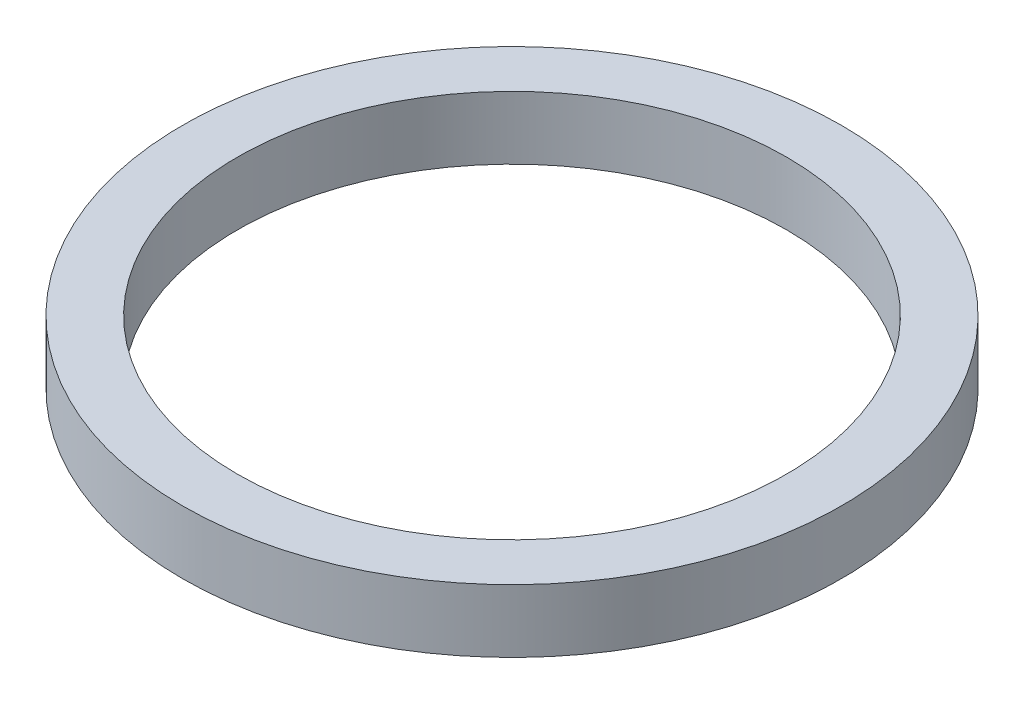
ISO-10303-21;
HEADER;
FILE_DESCRIPTION(('STEP AP214'),'2;1');
FILE_NAME('part.step','',(''),(''),'','','');
FILE_SCHEMA(('AUTOMOTIVE_DESIGN { 1 0 10303 214 1 1 1 1 }'));
ENDSEC;
DATA;
#1=APPLICATION_CONTEXT('core data for automotive mechanical design processes');
#2=APPLICATION_PROTOCOL_DEFINITION('international standard','automotive_design',2000,#1);
#3=PRODUCT_CONTEXT('',#1,'mechanical');
#4=PRODUCT('Part','Part','',(#3));
#5=PRODUCT_RELATED_PRODUCT_CATEGORY('part','',(#4));
#6=PRODUCT_DEFINITION_FORMATION('','',#4);
#7=PRODUCT_DEFINITION_CONTEXT('part definition',#1,'design');
#8=PRODUCT_DEFINITION('design','',#6,#7);
#9=PRODUCT_DEFINITION_SHAPE('','',#8);
#10=(LENGTH_UNIT() NAMED_UNIT(*) SI_UNIT(.MILLI.,.METRE.));
#11=(NAMED_UNIT(*) PLANE_ANGLE_UNIT() SI_UNIT($,.RADIAN.));
#12=(NAMED_UNIT(*) SI_UNIT($,.STERADIAN.) SOLID_ANGLE_UNIT());
#13=UNCERTAINTY_MEASURE_WITH_UNIT(LENGTH_MEASURE(1.E-05),#10,'distance_accuracy_value','');
#14=(GEOMETRIC_REPRESENTATION_CONTEXT(3) GLOBAL_UNCERTAINTY_ASSIGNED_CONTEXT((#13)) GLOBAL_UNIT_ASSIGNED_CONTEXT((#10,
#11,#12)) REPRESENTATION_CONTEXT('',''));
#15=CARTESIAN_POINT('',(0.,0.,0.));
#16=DIRECTION('',(0.,0.,1.));
#17=DIRECTION('',(1.,0.,0.));
#18=AXIS2_PLACEMENT_3D('',#15,#16,#17);
#19=CARTESIAN_POINT('',(0.,2.87,0.));
#20=DIRECTION('',(0.,1.,0.));
#21=DIRECTION('',(0.,0.,1.));
#22=AXIS2_PLACEMENT_3D('',#19,#20,#21);
#23=PLANE('',#22);
#24=CARTESIAN_POINT('',(0.,2.87,0.));
#25=DIRECTION('',(0.,1.,0.));
#26=DIRECTION('',(0.,0.,1.));
#27=AXIS2_PLACEMENT_3D('',#24,#25,#26);
#28=CIRCLE('',#27,15.);
#29=CARTESIAN_POINT('',(0.,2.87,15.));
#30=VERTEX_POINT('',#29);
#31=EDGE_CURVE('E10',#30,#30,#28,.T.);
#32=ORIENTED_EDGE('',*,*,#31,.T.);
#33=EDGE_LOOP('',(#32));
#34=FACE_BOUND('',#33,.T.);
#35=CARTESIAN_POINT('',(0.,2.87,0.));
#36=DIRECTION('',(0.,1.,0.));
#37=DIRECTION('',(0.,0.,1.));
#38=AXIS2_PLACEMENT_3D('',#35,#36,#37);
#39=CIRCLE('',#38,12.5);
#40=CARTESIAN_POINT('',(0.,2.87,12.5));
#41=VERTEX_POINT('',#40);
#42=EDGE_CURVE('E48',#41,#41,#39,.T.);
#43=ORIENTED_EDGE('',*,*,#42,.F.);
#44=EDGE_LOOP('',(#43));
#45=FACE_BOUND('',#44,.T.);
#46=ADVANCED_FACE('F37',(#34,#45),#23,.T.);
#47=CARTESIAN_POINT('',(0.,0.,0.));
#48=DIRECTION('',(0.,1.,0.));
#49=DIRECTION('',(0.,0.,1.));
#50=AXIS2_PLACEMENT_3D('',#47,#48,#49);
#51=PLANE('',#50);
#52=CARTESIAN_POINT('',(0.,0.,0.));
#53=DIRECTION('',(0.,1.,0.));
#54=DIRECTION('',(0.,0.,1.));
#55=AXIS2_PLACEMENT_3D('',#52,#53,#54);
#56=CIRCLE('',#55,15.);
#57=CARTESIAN_POINT('',(0.,0.,15.));
#58=VERTEX_POINT('',#57);
#59=EDGE_CURVE('E41',#58,#58,#56,.T.);
#60=ORIENTED_EDGE('',*,*,#59,.F.);
#61=EDGE_LOOP('',(#60));
#62=FACE_BOUND('',#61,.T.);
#63=CARTESIAN_POINT('',(0.,0.,0.));
#64=DIRECTION('',(0.,1.,0.));
#65=DIRECTION('',(0.,0.,1.));
#66=AXIS2_PLACEMENT_3D('',#63,#64,#65);
#67=CIRCLE('',#66,12.5);
#68=CARTESIAN_POINT('',(0.,0.,12.5));
#69=VERTEX_POINT('',#68);
#70=EDGE_CURVE('E50',#69,#69,#67,.T.);
#71=ORIENTED_EDGE('',*,*,#70,.T.);
#72=EDGE_LOOP('',(#71));
#73=FACE_BOUND('',#72,.T.);
#74=ADVANCED_FACE('F60',(#62,#73),#51,.F.);
#75=CARTESIAN_POINT('',(0.,2.87,0.));
#76=DIRECTION('',(0.,-1.,0.));
#77=DIRECTION('',(0.,0.,-1.));
#78=AXIS2_PLACEMENT_3D('',#75,#76,#77);
#79=CYLINDRICAL_SURFACE('',#78,15.);
#80=ORIENTED_EDGE('',*,*,#31,.F.);
#81=EDGE_LOOP('',(#80));
#82=FACE_BOUND('',#81,.T.);
#83=ORIENTED_EDGE('',*,*,#59,.T.);
#84=EDGE_LOOP('',(#83));
#85=FACE_BOUND('',#84,.T.);
#86=ADVANCED_FACE('F39',(#82,#85),#79,.T.);
#87=CARTESIAN_POINT('',(0.,2.87,0.));
#88=DIRECTION('',(0.,-1.,0.));
#89=DIRECTION('',(0.,0.,-1.));
#90=AXIS2_PLACEMENT_3D('',#87,#88,#89);
#91=CYLINDRICAL_SURFACE('',#90,12.5);
#92=ORIENTED_EDGE('',*,*,#42,.T.);
#93=EDGE_LOOP('',(#92));
#94=FACE_BOUND('',#93,.T.);
#95=ORIENTED_EDGE('',*,*,#70,.F.);
#96=EDGE_LOOP('',(#95));
#97=FACE_BOUND('',#96,.T.);
#98=ADVANCED_FACE('F56',(#94,#97),#91,.F.);
#99=CLOSED_SHELL('',(#46,#74,#86,#98));
#100=MANIFOLD_SOLID_BREP('B2',#99);
#101=ADVANCED_BREP_SHAPE_REPRESENTATION('',(#18,#100),#14);
#102=SHAPE_DEFINITION_REPRESENTATION(#9,#101);
ENDSEC;
END-ISO-10303-21;
